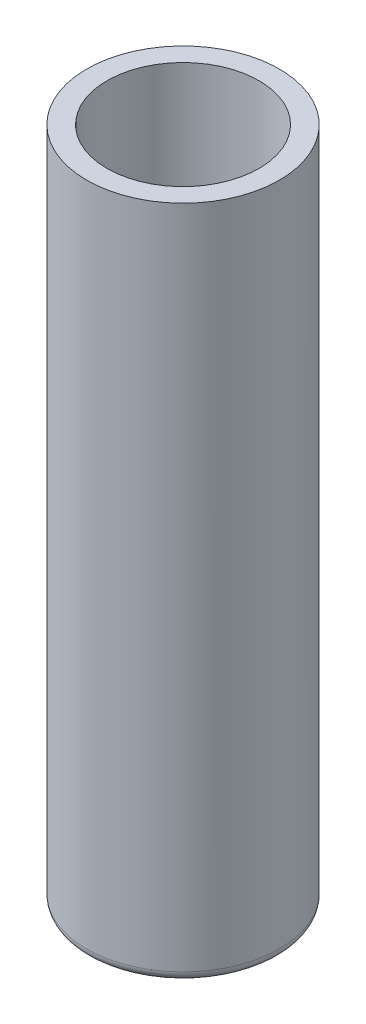
ISO-10303-21;
HEADER;
FILE_DESCRIPTION(('STEP AP214'),'2;1');
FILE_NAME('part.step','',(''),(''),'','','');
FILE_SCHEMA(('AUTOMOTIVE_DESIGN { 1 0 10303 214 1 1 1 1 }'));
ENDSEC;
DATA;
#1=APPLICATION_CONTEXT('core data for automotive mechanical design processes');
#2=APPLICATION_PROTOCOL_DEFINITION('international standard','automotive_design',2000,#1);
#3=PRODUCT_CONTEXT('',#1,'mechanical');
#4=PRODUCT('Part','Part','',(#3));
#5=PRODUCT_RELATED_PRODUCT_CATEGORY('part','',(#4));
#6=PRODUCT_DEFINITION_FORMATION('','',#4);
#7=PRODUCT_DEFINITION_CONTEXT('part definition',#1,'design');
#8=PRODUCT_DEFINITION('design','',#6,#7);
#9=PRODUCT_DEFINITION_SHAPE('','',#8);
#10=(LENGTH_UNIT() NAMED_UNIT(*) SI_UNIT(.MILLI.,.METRE.));
#11=(NAMED_UNIT(*) PLANE_ANGLE_UNIT() SI_UNIT($,.RADIAN.));
#12=(NAMED_UNIT(*) SI_UNIT($,.STERADIAN.) SOLID_ANGLE_UNIT());
#13=UNCERTAINTY_MEASURE_WITH_UNIT(LENGTH_MEASURE(1.E-05),#10,'distance_accuracy_value','');
#14=(GEOMETRIC_REPRESENTATION_CONTEXT(3) GLOBAL_UNCERTAINTY_ASSIGNED_CONTEXT((#13)) GLOBAL_UNIT_ASSIGNED_CONTEXT((#10,
#11,#12)) REPRESENTATION_CONTEXT('',''));
#15=CARTESIAN_POINT('',(0.,0.,0.));
#16=DIRECTION('',(0.,0.,1.));
#17=DIRECTION('',(1.,0.,0.));
#18=AXIS2_PLACEMENT_3D('',#15,#16,#17);
#19=CARTESIAN_POINT('',(0.,0.644355282187,0.774237036705));
#20=DIRECTION('',(0.,1.,0.));
#21=DIRECTION('',(0.,0.,1.));
#22=AXIS2_PLACEMENT_3D('',#19,#20,#21);
#23=PLANE('',#22);
#24=CARTESIAN_POINT('',(0.,0.644355282187,0.));
#25=DIRECTION('',(0.,-1.,0.));
#26=DIRECTION('',(0.,0.,-1.));
#27=AXIS2_PLACEMENT_3D('',#24,#25,#26);
#28=CIRCLE('',#27,0.774237036705);
#29=CARTESIAN_POINT('',(0.,0.644355282187,-0.774237036705));
#30=VERTEX_POINT('',#29);
#31=EDGE_CURVE('E120',#30,#30,#28,.T.);
#32=ORIENTED_EDGE('',*,*,#31,.T.);
#33=EDGE_LOOP('',(#32));
#34=FACE_BOUND('',#33,.T.);
#35=ADVANCED_FACE('F16',(#34),#23,.F.);
#36=CARTESIAN_POINT('',(0.,0.323807125575,1.3491904568));
#37=CARTESIAN_POINT('',(0.,0.353262221282,1.32215549052));
#38=CARTESIAN_POINT('',(0.,0.381219804809,1.29383961818));
#39=CARTESIAN_POINT('',(0.,0.407679876157,1.2642428398));
#40=CARTESIAN_POINT('',(0.,0.488846989831,1.16384237585));
#41=CARTESIAN_POINT('',(0.,0.554181499343,1.04989939876));
#42=CARTESIAN_POINT('',(0.,0.591831059317,0.964505493118));
#43=CARTESIAN_POINT('',(0.,0.621888986932,0.8726180391));
#44=CARTESIAN_POINT('',(0.,0.644355282187,0.774237036705));
#45=(BOUNDED_CURVE() B_SPLINE_CURVE(5,(#36,#37,#38,#39,#40,#41,#42,#43,#44),.UNSPECIFIED.,.F.,
.F.) B_SPLINE_CURVE_WITH_KNOTS((6,3,6),(0.582420147271,0.789666510541,1.2562929266),
.UNSPECIFIED.) CURVE() GEOMETRIC_REPRESENTATION_ITEM() RATIONAL_B_SPLINE_CURVE((1.,1.,1.,1.,1.,
1.,1.,1.,1.)) REPRESENTATION_ITEM(''));
#46=CARTESIAN_POINT('',(0.,0.218004316092,0.));
#47=DIRECTION('',(0.,-1.,0.));
#48=AXIS1_PLACEMENT('',#46,#47);
#49=SURFACE_OF_REVOLUTION('',#45,#48);
#50=ORIENTED_EDGE('',*,*,#31,.F.);
#51=EDGE_LOOP('',(#50));
#52=FACE_BOUND('',#51,.T.);
#53=CARTESIAN_POINT('',(0.,0.323807125575074,0.));
#54=DIRECTION('',(0.,1.,0.));
#55=DIRECTION('',(0.479425538604203,0.,0.877582561890372));
#56=AXIS2_PLACEMENT_3D('',#53,#54,#55);
#57=CIRCLE('',#56,1.34919045680404);
#58=CARTESIAN_POINT('',(0.646836361432927,0.323807125575074,1.18402601756013));
#59=VERTEX_POINT('',#58);
#60=EDGE_CURVE('E123',#59,#59,#57,.T.);
#61=ORIENTED_EDGE('',*,*,#60,.F.);
#62=EDGE_LOOP('',(#61));
#63=FACE_BOUND('',#62,.T.);
#64=ADVANCED_FACE('F138',(#52,#63),#49,.T.);
#65=CARTESIAN_POINT('',(0.,2.,0.));
#66=DIRECTION('',(0.,1.,0.));
#67=DIRECTION('',(0.,0.,1.));
#68=AXIS2_PLACEMENT_3D('',#65,#66,#67);
#69=PLANE('',#68);
#70=CARTESIAN_POINT('',(0.,2.,0.));
#71=DIRECTION('',(0.,1.,0.));
#72=DIRECTION('',(0.,0.,1.));
#73=AXIS2_PLACEMENT_3D('',#70,#71,#72);
#74=CIRCLE('',#73,2.25);
#75=CARTESIAN_POINT('',(0.,2.,2.25));
#76=VERTEX_POINT('',#75);
#77=EDGE_CURVE('E124',#76,#76,#74,.T.);
#78=ORIENTED_EDGE('',*,*,#77,.T.);
#79=EDGE_LOOP('',(#78));
#80=FACE_BOUND('',#79,.T.);
#81=ADVANCED_FACE('F141',(#80),#69,.T.);
#82=CARTESIAN_POINT('',(0.,1.,0.));
#83=DIRECTION('',(0.,1.,0.));
#84=DIRECTION('',(0.479425538604204,0.,0.877582561890373));
#85=AXIS2_PLACEMENT_3D('',#82,#83,#84);
#86=TOROIDAL_SURFACE('',#85,2.08591509775,1.);
#87=ORIENTED_EDGE('',*,*,#60,.T.);
#88=EDGE_LOOP('',(#87));
#89=FACE_BOUND('',#88,.T.);
#90=CARTESIAN_POINT('',(0.,0.,0.));
#91=DIRECTION('',(0.,-1.,0.));
#92=DIRECTION('',(-0.479425538604284,0.,-0.877582561890328));
#93=AXIS2_PLACEMENT_3D('',#90,#91,#92);
#94=CIRCLE('',#93,2.08591509775083);
#95=CARTESIAN_POINT('',(-1.00004085929464,0.,-1.83056277542366));
#96=VERTEX_POINT('',#95);
#97=CARTESIAN_POINT('',(1.00004096922105,0.,1.83056271536982));
#98=VERTEX_POINT('',#97);
#99=EDGE_CURVE('E46',#96,#98,#94,.T.);
#100=ORIENTED_EDGE('',*,*,#99,.T.);
#101=CARTESIAN_POINT('',(1.00004096922142,0.,1.83056271536922));
#102=CARTESIAN_POINT('',(0.973620016228702,2.55590095980319E-10,1.84499716544792));
#103=CARTESIAN_POINT('',(0.946888830593454,2.50192515225927E-11,1.85886387068713));
#104=CARTESIAN_POINT('',(0.89285595730822,2.83330282901089E-10,1.88543837733781));
#105=CARTESIAN_POINT('',(0.865554260817494,7.72223315841215E-10,1.89814616077403));
#106=CARTESIAN_POINT('',(0.810430256068048,4.16138878335174E-09,1.92237935423339));
#107=CARTESIAN_POINT('',(0.78260793092103,7.06173957446335E-09,1.93390472582225));
#108=CARTESIAN_POINT('',(0.726491800008633,1.79146607612937E-08,1.95575111161621));
#109=CARTESIAN_POINT('',(0.698197970982394,2.58674811349764E-08,1.96607206620118));
#110=CARTESIAN_POINT('',(0.655446891171035,4.62696584589538E-08,1.98063889023116));
#111=CARTESIAN_POINT('',(0.64114404762303,5.44831972945107E-08,1.98534228705848));
#112=CARTESIAN_POINT('',(0.612429183835539,7.19644363400583E-08,1.99443858163827));
#113=CARTESIAN_POINT('',(0.598017095721739,8.1232852463539E-08,1.9988312652009));
#114=CARTESIAN_POINT('',(0.554638750983609,1.04003647469847E-07,2.01152602768013));
#115=CARTESIAN_POINT('',(0.525529430669982,1.1247255857007E-07,2.01934515437546));
#116=CARTESIAN_POINT('',(0.46699265250406,1.12410175096491E-07,2.0336761164968));
#117=CARTESIAN_POINT('',(0.43756519605851,1.03878955663797E-07,2.0401879577009));
#118=CARTESIAN_POINT('',(0.378453379659475,7.38262440918185E-08,2.05191616216019));
#119=CARTESIAN_POINT('',(0.348769033555702,5.23054480128835E-08,2.0571325948101));
#120=CARTESIAN_POINT('',(0.289191910216967,1.71166566192791E-08,2.06616342920765));
#121=CARTESIAN_POINT('',(0.259299154711054,3.44785468011661E-09,2.06997797495469));
#122=CARTESIAN_POINT('',(0.21381055874295,-1.78948346428999E-09,2.07497512464698));
#123=CARTESIAN_POINT('',(0.198253723325132,-8.25698081945442E-10,2.07654116959));
#124=CARTESIAN_POINT('',(0.128688535158807,5.09055162199945E-09,2.08275397412306));
#125=CARTESIAN_POINT('',(0.0744846540359525,1.40177217768786E-08,2.08547169885343));
#126=CARTESIAN_POINT('',(-0.00495417032186562,4.20990059427245E-08,2.08635457221228));
#127=CARTESIAN_POINT('',(-0.0301871298532294,5.32361669127613E-08,2.08617666581318));
#128=CARTESIAN_POINT('',(-0.0856680761166048,7.45567110440251E-08,2.08476283154714));
#129=CARTESIAN_POINT('',(-0.115911798386098,8.41060365691973E-08,2.08332281456203));
#130=CARTESIAN_POINT('',(-0.159760631238324,8.96318324655248E-08,2.08025775210371));
#131=CARTESIAN_POINT('',(-0.173405507921172,9.01777509409901E-08,2.07916610517971));
#132=CARTESIAN_POINT('',(-0.202444778352549,8.93129469429258E-08,2.07655012775837));
#133=CARTESIAN_POINT('',(-0.217835785064478,8.76383717942788E-08,2.07498797856895));
#134=CARTESIAN_POINT('',(-0.263949791444024,8.10999200787094E-08,2.06978530692665));
#135=CARTESIAN_POINT('',(-0.294616158348227,7.47212926439495E-08,2.06562839922522));
#136=CARTESIAN_POINT('',(-0.355728189931065,5.86728548987548E-08,2.05593861830656));
#137=CARTESIAN_POINT('',(-0.386173861942035,4.90031544470416E-08,2.05040579102031));
#138=CARTESIAN_POINT('',(-0.446789143862353,2.9545331306053E-08,2.03799450685844));
#139=CARTESIAN_POINT('',(-0.476958767730657,1.97572146635175E-08,2.031116118422));
#140=CARTESIAN_POINT('',(-0.536941650139671,5.3719905619769E-09,2.01595918846943));
#141=CARTESIAN_POINT('',(-0.566754932887884,7.74528477617194E-10,2.00768074264962));
#142=CARTESIAN_POINT('',(-0.608450561089243,-3.14993293576871E-10,1.99524188413974));
#143=CARTESIAN_POINT('',(-0.620476742782648,2.3154627591072E-12,1.99155235059498));
#144=CARTESIAN_POINT('',(-0.66531437873013,2.02327735821238E-09,1.97734724447358));
#145=CARTESIAN_POINT('',(-0.697904136701555,5.17818525262745E-09,1.96611840245121));
#146=CARTESIAN_POINT('',(-0.757855990764666,1.66098090604508E-08,1.94379454528107));
#147=CARTESIAN_POINT('',(-0.785297411762699,2.40869470050219E-08,1.93291136447365));
#148=CARTESIAN_POINT('',(-0.824839225806196,3.66334486994587E-08,1.91624452028575));
#149=CARTESIAN_POINT('',(-0.837135014590332,4.07883716598536E-08,1.91092100730543));
#150=CARTESIAN_POINT('',(-0.876881734521019,5.31520181403223E-08,1.89324899409561));
#151=CARTESIAN_POINT('',(-0.904118973119294,5.99581046390181E-08,1.88041525831659));
#152=CARTESIAN_POINT('',(-0.960066175258996,6.47107804711426E-08,1.85252980186985));
#153=CARTESIAN_POINT('',(-0.988728986724914,6.19382595539475E-08,1.83738347263796));
#154=CARTESIAN_POINT('',(-1.03706400288067,5.26852898473215E-08,1.81036513960866));
#155=CARTESIAN_POINT('',(-1.05692250060451,4.75205478015137E-08,1.79882491401922));
#156=CARTESIAN_POINT('',(-1.0946767376956,3.91701273086659E-08,1.77604638700863));
#157=CARTESIAN_POINT('',(-1.11260244105081,3.5859213929405E-08,1.76485774113828));
#158=CARTESIAN_POINT('',(-1.14911419568272,2.94195925467909E-08,1.74128975483843));
#159=CARTESIAN_POINT('',(-1.16767991887689,2.63119169178077E-08,1.72887888040307));
#160=CARTESIAN_POINT('',(-1.20234783748841,2.11102525773182E-08,1.70489105016149));
#161=CARTESIAN_POINT('',(-1.21849316797756,1.89417339467199E-08,1.69337625300445));
#162=CARTESIAN_POINT('',(-1.26038544782857,1.37765934258419E-08,1.66258836280261));
#163=CARTESIAN_POINT('',(-1.28586062934619,1.1103429270499E-08,1.6429430003077));
#164=CARTESIAN_POINT('',(-1.32810511434412,8.08439385705062E-09,1.60878907469262));
#165=CARTESIAN_POINT('',(-1.34511927237676,7.27340786857504E-09,1.59458178485156));
#166=CARTESIAN_POINT('',(-1.37111476094013,5.83265156735253E-09,1.57215945762858));
#167=CARTESIAN_POINT('',(-1.3802580421762,5.28612021387553E-09,1.56413183849364));
#168=CARTESIAN_POINT('',(-1.39056409331469,6.48649450592304E-09,1.55494410959932));
#169=CARTESIAN_POINT('',(-1.39178727259301,6.65824743617644E-09,1.55385141435388));
#170=CARTESIAN_POINT('',(-1.40929719170774,9.3710678431113E-09,1.5381737539224));
#171=CARTESIAN_POINT('',(-1.42536634464787,1.50152782067024E-08,1.52334384218931));
#172=CARTESIAN_POINT('',(-1.46335183889691,2.8103548030481E-08,1.4871415106579));
#173=CARTESIAN_POINT('',(-1.48503598163178,3.53644698089976E-08,1.46552488068722));
#174=CARTESIAN_POINT('',(-1.52742595646814,4.80372796771684E-08,1.42135228617864));
#175=CARTESIAN_POINT('',(-1.54813175761216,5.34491092900673E-08,1.39879629195903));
#176=CARTESIAN_POINT('',(-1.58852025333664,5.99856148680693E-08,1.3527854527112));
#177=CARTESIAN_POINT('',(-1.60820293424188,6.11102335440029E-08,1.32933059567588));
#178=CARTESIAN_POINT('',(-1.64650791214094,5.88496213345817E-08,1.28157052400167));
#179=CARTESIAN_POINT('',(-1.66513021432492,5.54644125251946E-08,1.25726531352591));
#180=CARTESIAN_POINT('',(-1.70127293482178,4.53088834710271E-08,1.20785025760038));
#181=CARTESIAN_POINT('',(-1.71879337863637,3.85386416028602E-08,1.18274043079319));
#182=CARTESIAN_POINT('',(-1.75271316245621,2.40055590679609E-08,1.13177530020019));
#183=CARTESIAN_POINT('',(-1.76911254885794,1.62427595177713E-08,1.1059200273287));
#184=CARTESIAN_POINT('',(-1.80069947247214,4.57194458387676E-09,1.05348195796478));
#185=CARTESIAN_POINT('',(-1.8158870819396,6.63699205394495E-10,1.02689920497714));
#186=CARTESIAN_POINT('',(-1.83691105160346,-2.87097531548682E-10,0.98842272375118));
#187=CARTESIAN_POINT('',(-1.84316354705826,3.29189826884568E-11,0.976753004872265));
#188=CARTESIAN_POINT('',(-1.86577485366657,2.42535156212427E-09,0.933561420534501));
#189=CARTESIAN_POINT('',(-1.88143908493151,6.54020423520969E-09,0.901670994362836));
#190=CARTESIAN_POINT('',(-1.90894561872275,2.12760867572818E-08,0.841878117774608));
#191=CARTESIAN_POINT('',(-1.92101134536298,3.08526689267056E-08,0.814077942285054));
#192=CARTESIAN_POINT('',(-1.93769720502207,4.70332807210353E-08,0.773204546754575));
#193=CARTESIAN_POINT('',(-1.94280384661165,5.24292295493686E-08,0.76032838606597));
#194=CARTESIAN_POINT('',(-1.95894590804127,6.85143482907463E-08,0.718393631715627));
#195=CARTESIAN_POINT('',(-1.96945422866863,7.74381149805578E-08,0.689129916876406));
#196=CARTESIAN_POINT('',(-1.98986001692114,8.38505205563952E-08,0.627952359565862));
#197=CARTESIAN_POINT('',(-1.99965331174465,8.04357180023634E-08,0.596003771523798));
#198=CARTESIAN_POINT('',(-2.01515544136504,6.86057811798089E-08,0.540661822191023));
#199=CARTESIAN_POINT('',(-2.02124081920852,6.18550490467588E-08,0.517373166219054));
#200=CARTESIAN_POINT('',(-2.0321331994681,5.09120315059358E-08,0.472543153280408));
#201=CARTESIAN_POINT('',(-2.03700440787522,4.65537773285179E-08,0.451017388246431));
#202=CARTESIAN_POINT('',(-2.04629703647807,3.80424950778996E-08,0.406695673807824));
#203=CARTESIAN_POINT('',(-2.05068176957652,3.39120105006511E-08,0.383892008735471));
#204=CARTESIAN_POINT('',(-2.05821901065029,2.69551349000042E-08,0.340832844133887));
#205=CARTESIAN_POINT('',(-2.06145570972763,2.40326359917876E-08,0.320591958709928));
#206=CARTESIAN_POINT('',(-2.06909823803521,1.70762845084099E-08,0.267818354766455));
#207=CARTESIAN_POINT('',(-2.07303602609716,1.34315205411491E-08,0.235216305359772));
#208=CARTESIAN_POINT('',(-2.07832540206102,9.07370958856472E-09,0.180700082374089));
#209=CARTESIAN_POINT('',(-2.08010158212812,7.78931308740085E-09,0.158825943741013));
#210=CARTESIAN_POINT('',(-2.08224787302048,5.58977054821366E-09,0.125893339213358));
#211=CARTESIAN_POINT('',(-2.08287842851809,4.80745063113927E-09,0.114851594649339));
#212=CARTESIAN_POINT('',(-2.08349174460766,5.33837623119273E-09,0.102646961101262));
#213=CARTESIAN_POINT('',(-2.08354916975235,5.40271789463204E-09,0.101487645008398));
#214=CARTESIAN_POINT('',(-2.08463705496358,6.84464976970062E-09,0.0791749660568968));
#215=CARTESIAN_POINT('',(-2.08536920785719,1.17340765930165E-08,0.0580057920622636));
#216=CARTESIAN_POINT('',(-2.08633134052462,2.25127701415499E-08,0.00718377634545966));
#217=CARTESIAN_POINT('',(-2.08624330848654,2.8019669618369E-08,-0.0224754793815258));
#218=CARTESIAN_POINT('',(-2.08479777938063,3.7825245096885E-08,-0.0817631750239387));
#219=CARTESIAN_POINT('',(-2.08344024679579,4.21238872906026E-08,-0.111391614053985));
#220=CARTESIAN_POINT('',(-2.07945040191561,4.72766782490763E-08,-0.170563136432743));
#221=CARTESIAN_POINT('',(-2.07681807458477,4.81307863862885E-08,-0.200106218770583));
#222=CARTESIAN_POINT('',(-2.07028574443831,4.63212588238489E-08,-0.259051700642297));
#223=CARTESIAN_POINT('',(-2.06638574718487,4.36576385588191E-08,-0.288454100792869));
#224=CARTESIAN_POINT('',(-2.05732427144374,3.56388796520543E-08,-0.347063222769805));
#225=CARTESIAN_POINT('',(-2.05216281890636,3.02837963759595E-08,-0.37626994860883));
#226=CARTESIAN_POINT('',(-2.04059029279259,1.89100487815844E-08,-0.434433781888149));
#227=CARTESIAN_POINT('',(-2.03417926515055,1.28914088591578E-08,-0.463390898463227));
#228=CARTESIAN_POINT('',(-2.0201120569086,3.47517488659849E-09,-0.52099924967929));
#229=CARTESIAN_POINT('',(-2.01245594224203,7.74421015489405E-11,-0.549650500431771));
#230=CARTESIAN_POINT('',(-1.99559424329144,-8.06903618768968E-11,-0.607798360975493));
#231=CARTESIAN_POINT('',(-1.98633713711208,3.44328646412929E-09,-0.637280021805686));
#232=CARTESIAN_POINT('',(-1.96656179857412,5.88744414924451E-09,-0.69581611084586));
#233=CARTESIAN_POINT('',(-1.95604359891139,4.80774434097143E-09,-0.724870550110327));
#234=CARTESIAN_POINT('',(-1.93376305434611,2.29465671035439E-09,-0.782499701199165));
#235=CARTESIAN_POINT('',(-1.92200067501864,8.6125910016362E-10,-0.811074399724339));
#236=CARTESIAN_POINT('',(-1.89723440000733,5.04750460977923E-10,-0.867683302499934));
#237=CARTESIAN_POINT('',(-1.88423040350267,1.58184345340755E-09,-0.895717462635444));
#238=CARTESIAN_POINT('',(-1.86386887805592,5.27230073846141E-08,-0.93735059195679));
#239=CARTESIAN_POINT('',(-1.85693855196033,7.80281441154535E-08,-0.951159656229674));
#240=CARTESIAN_POINT('',(-1.84703923402281,9.39482694707117E-08,-0.970224768482834));
#241=CARTESIAN_POINT('',(-1.84423037039144,9.63063028144805E-08,-0.975563923413399));
#242=CARTESIAN_POINT('',(-1.82819664427281,1.03145304744909E-07,-1.00569279885735));
#243=CARTESIAN_POINT('',(-1.81444719307063,8.3851406345384E-08,-1.03020545524118));
#244=CARTESIAN_POINT('',(-1.78242642280068,4.84571712002247E-08,-1.08469196011908));
#245=CARTESIAN_POINT('',(-1.76388199437419,3.43502309745508E-08,-1.1145048037605));
#246=CARTESIAN_POINT('',(-1.71914224149379,1.01442409128504E-08,-1.18252540770602));
#247=CARTESIAN_POINT('',(-1.69239505535754,2.76444816756647E-09,-1.22037310806868));
#248=CARTESIAN_POINT('',(-1.65016700744607,-4.3153584945668E-10,-1.27617072492337));
#249=CARTESIAN_POINT('',(-1.63557273520754,-1.37667229284311E-10,-1.2948004682836));
#250=CARTESIAN_POINT('',(-1.60172019640364,1.75147917318662E-10,-1.33657571530106));
#251=CARTESIAN_POINT('',(-1.58227390446825,9.7462863602556E-11,-1.35956976486948));
#252=CARTESIAN_POINT('',(-1.5424055607416,1.28111386354719E-09,-1.40469596272553));
#253=CARTESIAN_POINT('',(-1.52198348571647,2.54248181590192E-09,-1.4268280904676));
#254=CARTESIAN_POINT('',(-1.48020871108127,8.41734104361082E-09,-1.47019731827349));
#255=CARTESIAN_POINT('',(-1.45885597565079,1.30309614518726E-08,-1.49143438382506));
#256=CARTESIAN_POINT('',(-1.41525500778331,2.80481736304582E-08,-1.53297226603727));
#257=CARTESIAN_POINT('',(-1.39300672774609,3.84520735451411E-08,-1.55327303280813));
#258=CARTESIAN_POINT('',(-1.35899894990591,6.2995141957526E-08,-1.58299532927535));
#259=CARTESIAN_POINT('',(-1.3475565031593,7.2666456117329E-08,-1.59278178882164));
#260=CARTESIAN_POINT('',(-1.32445238876531,9.27629786237313E-08,-1.61210878031469));
#261=CARTESIAN_POINT('',(-1.31279057654226,1.03188698043607E-07,-1.62164913949127));
#262=CARTESIAN_POINT('',(-1.27748930798247,1.28289800064003E-07,-1.64987595589744));
#263=CARTESIAN_POINT('',(-1.25353319572737,1.36790332202173E-07,-1.66816887353146));
#264=CARTESIAN_POINT('',(-1.20483179832901,1.3411487964563E-07,-1.70366969449366));
#265=CARTESIAN_POINT('',(-1.18008652006945,1.22939066536489E-07,-1.72087760728214));
#266=CARTESIAN_POINT('',(-1.12985515256796,8.66493964949862E-08,-1.75417305155361));
#267=CARTESIAN_POINT('',(-1.1043691081103,6.15363805059561E-08,-1.77026065056821));
#268=CARTESIAN_POINT('',(-1.05270887061602,1.92992691818116E-08,-1.80128335350062));
#269=CARTESIAN_POINT('',(-1.02653475493557,2.17427981862714E-09,-1.81621858623621));
#270=CARTESIAN_POINT('',(-1.00004078601,0.,-1.83056281546));
#271=B_SPLINE_CURVE_WITH_KNOTS('',3,(#101,#102,#103,#104,#105,#106,#107,#108,#109,#110,#111,
#112,#113,#114,#115,#116,#117,#118,#119,#120,#121,#122,#123,#124,#125,#126,#127,#128,#129,#130,
#131,#132,#133,#134,#135,#136,#137,#138,#139,#140,#141,#142,#143,#144,#145,#146,#147,#148,#149,
#150,#151,#152,#153,#154,#155,#156,#157,#158,#159,#160,#161,#162,#163,#164,#165,#166,#167,#168,
#169,#170,#171,#172,#173,#174,#175,#176,#177,#178,#179,#180,#181,#182,#183,#184,#185,#186,#187,
#188,#189,#190,#191,#192,#193,#194,#195,#196,#197,#198,#199,#200,#201,#202,#203,#204,#205,#206,
#207,#208,#209,#210,#211,#212,#213,#214,#215,#216,#217,#218,#219,#220,#221,#222,#223,#224,#225,
#226,#227,#228,#229,#230,#231,#232,#233,#234,#235,#236,#237,#238,#239,#240,#241,#242,#243,#244,
#245,#246,#247,#248,#249,#250,#251,#252,#253,#254,#255,#256,#257,#258,#259,#260,#261,#262,#263,
#264,#265,#266,#267,#268,#269,#270),.UNSPECIFIED.,.F.,.F.,(4,2,2,2,2,2,2,2,2,2,2,2,2,2,2,2,2,2,
2,2,2,2,2,2,2,2,2,2,2,2,2,2,2,2,2,2,2,2,2,2,2,2,2,2,2,2,2,2,2,2,2,2,2,2,2,2,2,2,2,2,2,2,2,2,2,2,
2,2,2,2,2,2,2,2,2,2,2,2,2,2,2,2,2,2,4),(0.,0.0903136425888522,0.180628685733513,
0.270946663638675,0.36126911049953,0.406435088176155,0.451631903510086,0.542022419618622,
0.632412536199143,0.722797809558612,0.81317379610278,0.860080162088081,1.02268503526549,
1.09837557981275,1.18917363899864,1.23023701959967,1.27664379213827,1.36945018439902,
1.46225347900993,1.55505205459972,1.64784428981006,1.68558200072959,1.78894318161119,
1.87747834634243,1.91767283373449,2.00796934781347,2.10518747740542,2.17408006378262,
2.23746338296922,2.30444702315456,2.36393278164863,2.460405085478,2.52689223578997,
2.56339224745287,2.56831275865082,2.63390079025989,2.72572412296402,2.81755035927337,
2.90937782263464,3.00120483649476,3.09302972430263,3.18485080951088,3.27666641557757,
3.31638325363484,3.42291950425642,3.51380705256276,3.55536064018706,3.64860558870562,
3.74881185957179,3.82100983680247,3.88720917882321,3.95685962728448,4.01834625606349,
4.11682223562421,4.18265024508129,4.21582812485258,4.21931034174301,4.28284556334696,
4.37179476268716,4.46074645064749,4.54969918777093,4.63865153460064,4.72760205168124,
4.81654929955999,4.90549183878812,4.99816501698219,5.09083579299501,5.18350913376536,
5.27619000613379,5.3225375289211,5.34063610368272,5.42492467365269,5.53021399058746,
5.6691327008569,5.74012008481814,5.83043418877263,5.92075044422269,6.01107017895099,
6.10139472073193,6.14656181450797,6.19175979857785,6.28215248386577,6.37254438089734,
6.46293082445301,6.55330714943722),.UNSPECIFIED.);
#272=EDGE_CURVE('E44',#98,#96,#271,.T.);
#273=ORIENTED_EDGE('',*,*,#272,.T.);
#274=EDGE_LOOP('',(#100,#273));
#275=FACE_BOUND('',#274,.T.);
#276=ADVANCED_FACE('F48',(#89,#275),#86,.T.);
#277=CARTESIAN_POINT('',(0.,11.,0.));
#278=DIRECTION('',(0.,1.,0.));
#279=DIRECTION('',(0.,0.,1.));
#280=AXIS2_PLACEMENT_3D('',#277,#278,#279);
#281=CYLINDRICAL_SURFACE('',#280,2.25);
#282=CARTESIAN_POINT('',(0.,20.,0.));
#283=DIRECTION('',(0.,1.,0.));
#284=DIRECTION('',(0.,0.,1.));
#285=AXIS2_PLACEMENT_3D('',#282,#283,#284);
#286=CIRCLE('',#285,2.25);
#287=CARTESIAN_POINT('',(0.,20.,2.25));
#288=VERTEX_POINT('',#287);
#289=EDGE_CURVE('E51',#288,#288,#286,.F.);
#290=ORIENTED_EDGE('',*,*,#289,.F.);
#291=EDGE_LOOP('',(#290));
#292=FACE_BOUND('',#291,.T.);
#293=ORIENTED_EDGE('',*,*,#77,.F.);
#294=EDGE_LOOP('',(#293));
#295=FACE_BOUND('',#294,.T.);
#296=ADVANCED_FACE('F75',(#292,#295),#281,.F.);
#297=CARTESIAN_POINT('',(0.,0.,0.));
#298=DIRECTION('',(0.,1.,0.));
#299=DIRECTION('',(0.,0.,1.));
#300=AXIS2_PLACEMENT_3D('',#297,#298,#299);
#301=PLANE('',#300);
#302=ORIENTED_EDGE('',*,*,#272,.F.);
#303=ORIENTED_EDGE('',*,*,#99,.F.);
#304=EDGE_LOOP('',(#302,#303));
#305=FACE_BOUND('',#304,.T.);
#306=CARTESIAN_POINT('',(2.55,0.,0.));
#307=CARTESIAN_POINT('',(2.55000075259111,-1.18256286497364E-13,-0.0400519309004626));
#308=CARTESIAN_POINT('',(2.5490564070711,0.,-0.0801037996388674));
#309=CARTESIAN_POINT('',(2.54528291907517,0.,-0.160118659926399));
#310=CARTESIAN_POINT('',(2.54245377659924,1.18256286497359E-13,-0.200081651475526));
#311=CARTESIAN_POINT('',(2.53491609395779,-1.18256286497363E-13,-0.279830004519342));
#312=CARTESIAN_POINT('',(2.53020755379226,-4.13897002740774E-13,-0.31961536601403));
#313=CARTESIAN_POINT('',(2.51892174946101,4.13897002740769E-13,-0.398920143915073));
#314=CARTESIAN_POINT('',(2.51234448529529,1.53733172446571E-12,-0.438439560321427));
#315=CARTESIAN_POINT('',(2.49733582938716,-1.53733172446568E-12,-0.517124746610917));
#316=CARTESIAN_POINT('',(2.48890443764475,-5.73542989512192E-12,-0.556290516494053));
#317=CARTESIAN_POINT('',(2.47020603890889,5.73542989512202E-12,-0.63418135689729));
#318=CARTESIAN_POINT('',(2.45993903191543,2.14043878560226E-11,-0.672906427417392));
#319=CARTESIAN_POINT('',(2.43759301552415,-2.14043878560228E-11,-0.749830317135968));
#320=CARTESIAN_POINT('',(2.42551400612633,-7.98821215289693E-11,-0.788029136334443));
#321=CARTESIAN_POINT('',(2.39956771745065,7.98821215289678E-11,-0.863814185776763));
#322=CARTESIAN_POINT('',(2.38570043817279,2.98124098259846E-10,-0.901400416020608));
#323=CARTESIAN_POINT('',(2.35499632392849,-3.22871045252395E-10,-0.978973944131822));
#324=CARTESIAN_POINT('',(2.33800854160088,-1.25139210980707E-09,-1.0189015649917));
#325=CARTESIAN_POINT('',(2.30204326968768,5.34999091135765E-09,-1.09784937162304));
#326=CARTESIAN_POINT('',(2.28306580830201,1.28797751313886E-08,-1.13686957024591));
#327=CARTESIAN_POINT('',(2.2431620739681,5.26988240054245E-08,-1.21390106778939));
#328=CARTESIAN_POINT('',(2.22223577448661,8.49884258054141E-08,-1.25191235296469));
#329=CARTESIAN_POINT('',(2.17850090143168,2.47005188977696E-07,-1.32683834742109));
#330=CARTESIAN_POINT('',(2.15569224996597,3.76736384312492E-07,-1.36375301123763));
#331=CARTESIAN_POINT('',(2.10817128472262,6.72718885859097E-07,-1.43641047336559));
#332=CARTESIAN_POINT('',(2.08345640948203,8.3901990757429E-07,-1.47215159952516));
#333=CARTESIAN_POINT('',(2.03216354781769,9.69891146494426E-07,-1.54226417590412));
#334=CARTESIAN_POINT('',(2.0055857461418,9.34481339640528E-07,-1.57663576141315));
#335=CARTESIAN_POINT('',(1.95069026514413,7.06794432239931E-07,-1.64395374032234));
#336=CARTESIAN_POINT('',(1.92237289808641,5.14545409777652E-07,-1.67690038770991));
#337=CARTESIAN_POINT('',(1.86395114608696,1.79045521183499E-07,-1.74114828731855));
#338=CARTESIAN_POINT('',(1.83384722578079,3.57819801829531E-08,-1.77244996339505));
#339=CARTESIAN_POINT('',(1.78459586053275,-2.15757146890978E-08,-1.82161700383318));
#340=CARTESIAN_POINT('',(1.76584364011014,-4.07313466868653E-09,-1.83988289662486));
#341=CARTESIAN_POINT('',(1.72441013595615,2.91934909177209E-08,-1.87897505602653));
#342=CARTESIAN_POINT('',(1.70161883515245,4.41075359830089E-08,-1.89968523327805));
#343=CARTESIAN_POINT('',(1.64643249100507,1.13387703722609E-07,-1.94805753238798));
#344=CARTESIAN_POINT('',(1.61370468790367,1.80684233072926E-07,-1.97534175204398));
#345=CARTESIAN_POINT('',(1.56489161392106,2.96150501711964E-07,-2.01399037691821));
#346=CARTESIAN_POINT('',(1.54932891171479,3.35122167479757E-07,-2.02601993949507));
#347=CARTESIAN_POINT('',(1.51836029456161,4.03648754477069E-07,-2.04938040671316));
#348=CARTESIAN_POINT('',(1.50296201608447,4.33435011172871E-07,-2.06072143573122));
#349=CARTESIAN_POINT('',(1.4577143559112,5.04809239309924E-07,-2.09325571764274));
#350=CARTESIAN_POINT('',(1.42752312956759,5.32291930123223E-07,-2.11397742620273));
#351=CARTESIAN_POINT('',(1.37748689664738,5.18135375336552E-07,-2.1467211020715));
#352=CARTESIAN_POINT('',(1.35790503590493,4.98136460457213E-07,-2.15914831318753));
#353=CARTESIAN_POINT('',(1.31218658785721,4.41117943060185E-07,-2.18728630491382));
#354=CARTESIAN_POINT('',(1.28592750579504,4.00721802655802E-07,-2.20279892217519));
#355=CARTESIAN_POINT('',(1.23287305626377,3.29957002809768E-07,-2.23287416281425));
#356=CARTESIAN_POINT('',(1.20607770252055,2.99588087068508E-07,-2.24743681046589));
#357=CARTESIAN_POINT('',(1.14116324677661,2.30778718810899E-07,-2.28122154240466));
#358=CARTESIAN_POINT('',(1.10280073805622,1.93966810499114E-07,-2.29997818244512));
#359=CARTESIAN_POINT('',(1.02518352569255,1.30144385589552E-07,-2.3355416959669));
#360=CARTESIAN_POINT('',(0.985928854259979,1.03133515729918E-07,-2.35234863970688));
#361=CARTESIAN_POINT('',(0.923622674099274,6.79275269713394E-08,-2.37719369330507));
#362=CARTESIAN_POINT('',(0.900836572437141,5.66295900752022E-08,-2.38590302154407));
#363=CARTESIAN_POINT('',(0.855023657173742,3.68847030270215E-08,-2.40266376265003));
#364=CARTESIAN_POINT('',(0.831996848573314,2.8437693766057E-08,-2.41071518915479));
#365=CARTESIAN_POINT('',(0.783535935539327,1.4861796934397E-08,-2.42688590436714));
#366=CARTESIAN_POINT('',(0.758079987789138,1.01219335190215E-08,-2.43493969659173));
#367=CARTESIAN_POINT('',(0.700038429384482,2.88166574124558E-09,-2.4523108202094));
#368=CARTESIAN_POINT('',(0.667379488771549,1.3285017713958E-09,-2.46138408027383));
#369=CARTESIAN_POINT('',(0.598865802231268,-2.14813509822542E-10,-2.47896046191399));
#370=CARTESIAN_POINT('',(0.562980611212407,-5.69366048433879E-11,-2.48734496557207));
#371=CARTESIAN_POINT('',(0.48799084835367,6.39605655479197E-10,-2.50316580839337));
#372=CARTESIAN_POINT('',(0.448858824205106,1.20778454676559E-09,-2.51047224126722));
#373=CARTESIAN_POINT('',(0.367380148184013,1.95010585038866E-09,-2.52372429927219));
#374=CARTESIAN_POINT('',(0.32501047559569,2.09187190177432E-09,-2.52952867135992));
#375=CARTESIAN_POINT('',(0.237097058470145,1.84667755384847E-09,-2.53933141808604));
#376=CARTESIAN_POINT('',(0.191536282645877,1.4225073064192E-09,-2.54317729330441));
#377=CARTESIAN_POINT('',(0.0973228470885844,4.99617735721556E-10,-2.54858854251568));
#378=CARTESIAN_POINT('',(0.0486606777644302,-2.1479887929817E-12,-2.54999045359722));
#379=CARTESIAN_POINT('',(-0.0417252396157644,1.84184337737805E-12,-2.550008185787));
#380=CARTESIAN_POINT('',(-0.0834493825462367,3.74191651774412E-10,-2.54899262050299));
#381=CARTESIAN_POINT('',(-0.166798620839247,1.7320948176664E-09,-2.54491440074407));
#382=CARTESIAN_POINT('',(-0.208423715253353,2.71765402337795E-09,-2.54185172674573));
#383=CARTESIAN_POINT('',(-0.291473607677529,5.17268786980516E-09,-2.53368718008025));
#384=CARTESIAN_POINT('',(-0.332898403901402,6.64216681792415E-09,-2.5285852892618));
#385=CARTESIAN_POINT('',(-0.415448059652887,9.94726754192398E-09,-2.51635442713868));
#386=CARTESIAN_POINT('',(-0.456572916698565,1.17828923440319E-08,-2.50922543907966));
#387=CARTESIAN_POINT('',(-0.53842347350064,1.57105422893282E-08,-2.4929575760928));
#388=CARTESIAN_POINT('',(-0.579149170209249,1.78025693886324E-08,-2.48381868583083));
#389=CARTESIAN_POINT('',(-0.660103227926096,2.21422457499202E-08,-2.46355301109971));
#390=CARTESIAN_POINT('',(-0.700331585454119,2.43898961001782E-08,-2.45242621272825));
#391=CARTESIAN_POINT('',(-0.78019396292966,2.89487547426955E-08,-2.42821152344298));
#392=CARTESIAN_POINT('',(-0.819827979096828,3.12599634389574E-08,-2.41512362006122));
#393=CARTESIAN_POINT('',(-0.898406110136434,3.58626554886017E-08,-2.38701824993502));
#394=CARTESIAN_POINT('',(-0.937350221059923,3.81541387290389E-08,-2.37200077214994));
#395=CARTESIAN_POINT('',(-1.01445463936226,4.26428597342173E-08,-2.34007243839796));
#396=CARTESIAN_POINT('',(-1.05261494275349,4.48400970195441E-08,-2.32316157280127));
#397=CARTESIAN_POINT('',(-1.12805973383756,4.90745739323679E-08,-2.28748721611825));
#398=CARTESIAN_POINT('',(-1.1653442176319,5.11118128477618E-08,-2.26872371678724));
#399=CARTESIAN_POINT('',(-1.23894746903142,5.49693073706431E-08,-2.2293893148543));
#400=CARTESIAN_POINT('',(-1.27526623295221,5.67895621503869E-08,-2.20881840535803));
#401=CARTESIAN_POINT('',(-1.34685047291747,6.01648698264685E-08,-2.16591876564952));
#402=CARTESIAN_POINT('',(-1.38211594561333,6.1719921879749E-08,-2.14359002984963));
#403=CARTESIAN_POINT('',(-1.45150857158427,6.452537238456E-08,-2.09722856081472));
#404=CARTESIAN_POINT('',(-1.48563572196428,6.57757700613227E-08,-2.07319582324646));
#405=CARTESIAN_POINT('',(-1.55266941715676,6.79412271625755E-08,-2.02348428480016));
#406=CARTESIAN_POINT('',(-1.58557595964103,6.88562859474693E-08,-1.99780548078268));
#407=CARTESIAN_POINT('',(-1.65008909690665,7.03291474826337E-08,-1.94486371460666));
#408=CARTESIAN_POINT('',(-1.68169569003503,7.08869497786399E-08,-1.91760075043386));
#409=CARTESIAN_POINT('',(-1.74353272197394,7.16321475680109E-08,-1.861556390766));
#410=CARTESIAN_POINT('',(-1.77376315990955,7.18195428258836E-08,-1.83277499430558));
#411=CARTESIAN_POINT('',(-1.83277499430558,7.18195428258947E-08,-1.77376315990956));
#412=CARTESIAN_POINT('',(-1.86155639076599,7.16321475680332E-08,-1.74353272197394));
#413=CARTESIAN_POINT('',(-1.91760075043386,7.08869497786177E-08,-1.68169569003503));
#414=CARTESIAN_POINT('',(-1.94486371460667,7.03291474825558E-08,-1.65008909690665));
#415=CARTESIAN_POINT('',(-1.99780548078266,6.88562859475472E-08,-1.58557595964104));
#416=CARTESIAN_POINT('',(-2.02348428480011,6.79412271628648E-08,-1.55266941715679));
#417=CARTESIAN_POINT('',(-2.0731958232465,6.57757700610334E-08,-1.48563572196426));
#418=CARTESIAN_POINT('',(-2.09722856081491,6.45253723834806E-08,-1.45150857158417));
#419=CARTESIAN_POINT('',(-2.14359002984944,6.17199218808284E-08,-1.38211594561343));
#420=CARTESIAN_POINT('',(-2.16591876564883,6.01648698304967E-08,-1.34685047291784));
#421=CARTESIAN_POINT('',(-2.20881840535872,5.67895621463588E-08,-1.27526623295185));
#422=CARTESIAN_POINT('',(-2.22938931485687,5.49693073556098E-08,-1.23894746903006));
#423=CARTESIAN_POINT('',(-2.26872371678467,5.11118128627951E-08,-1.16534421763326));
#424=CARTESIAN_POINT('',(-2.28748721610864,4.90745739884725E-08,-1.12805973384264));
#425=CARTESIAN_POINT('',(-2.32316157281088,4.48400970718597E-08,-1.05261494274842));
#426=CARTESIAN_POINT('',(-2.34007243843381,4.26428597416727E-08,-1.01445463934334));
#427=CARTESIAN_POINT('',(-2.37200077211408,3.81541387215836E-08,-0.937350221078842));
#428=CARTESIAN_POINT('',(-2.38701824980121,3.58626555110955E-08,-0.898406110207037));
#429=CARTESIAN_POINT('',(-2.41512362019502,3.12599634164637E-08,-0.819827979026232));
#430=CARTESIAN_POINT('',(-2.42821152394234,2.89487546452658E-08,-0.780193962666183));
#431=CARTESIAN_POINT('',(-2.4524262122289,2.43898961976074E-08,-0.700331585717599));
#432=CARTESIAN_POINT('',(-2.46355300923609,2.21422461171421E-08,-0.660103228909409));
#433=CARTESIAN_POINT('',(-2.48381868769444,1.78025690214131E-08,-0.579149169225945));
#434=CARTESIAN_POINT('',(-2.49295758304787,1.57105409178839E-08,-0.538423469830909));
#435=CARTESIAN_POINT('',(-2.50922543212464,1.17828937154658E-08,-0.456572920368269));
#436=CARTESIAN_POINT('',(-2.5163544011823,9.94727266042476E-09,-0.415448073348358));
#437=CARTESIAN_POINT('',(-2.52858531521796,6.64216169946567E-09,-0.332898390206047));
#438=CARTESIAN_POINT('',(-2.53368727694955,5.17266876746708E-09,-0.291473556565975));
#439=CARTESIAN_POINT('',(-2.54185162987729,2.71767312554595E-09,-0.208423766364458));
#440=CARTESIAN_POINT('',(-2.54491403922773,1.73216610763107E-09,-0.166798811587636));
#441=CARTESIAN_POINT('',(-2.5489929820159,3.74120362489651E-10,-0.0834491917996705));
#442=CARTESIAN_POINT('',(-2.55000953496511,1.57578940172591E-12,-0.0417245277432609));
#443=CARTESIAN_POINT('',(-2.55,0.,0.));
#444=B_SPLINE_CURVE_WITH_KNOTS('',3,(#306,#307,#308,#309,#310,#311,#312,#313,#314,#315,#316,
#317,#318,#319,#320,#321,#322,#323,#324,#325,#326,#327,#328,#329,#330,#331,#332,#333,#334,#335,
#336,#337,#338,#339,#340,#341,#342,#343,#344,#345,#346,#347,#348,#349,#350,#351,#352,#353,#354,
#355,#356,#357,#358,#359,#360,#361,#362,#363,#364,#365,#366,#367,#368,#369,#370,#371,#372,#373,
#374,#375,#376,#377,#378,#379,#380,#381,#382,#383,#384,#385,#386,#387,#388,#389,#390,#391,#392,
#393,#394,#395,#396,#397,#398,#399,#400,#401,#402,#403,#404,#405,#406,#407,#408,#409,#410,#411,
#412,#413,#414,#415,#416,#417,#418,#419,#420,#421,#422,#423,#424,#425,#426,#427,#428,#429,#430,
#431,#432,#433,#434,#435,#436,#437,#438,#439,#440,#441,#442,#443),.UNSPECIFIED.,.F.,.F.,(4,2,2,
2,2,2,2,2,2,2,2,2,2,2,2,2,2,2,2,2,2,2,2,2,2,2,2,2,2,2,2,2,2,2,2,2,2,2,2,2,2,2,2,2,2,2,2,2,2,2,2,
2,2,2,2,2,2,2,2,2,2,2,2,2,2,2,2,2,4),(0.,0.120144572607406,0.240289145214809,0.360433717822215,
0.480578290429621,0.600722863037024,0.72086743564443,0.841012008251836,0.961156580859241,
1.09127421967334,1.22139001456682,1.35150758123412,1.48163053490607,1.61193149236667,
1.74221954601332,1.87248428000494,2.00271528277654,2.08124159532572,2.17360700430893,
2.30137469092948,2.36038008454438,2.41774782286768,2.52756141316356,2.59713128692455,
2.68860644964796,2.780079274051,2.90813069591135,3.03617750191618,3.10935020351909,
3.18252138792278,3.26260766242179,3.36426797778439,3.47478883188627,3.5941702786934,
3.72241249061072,3.85951575860525,4.0054804922874,4.13064137717731,4.25580345575276,
4.3809666484347,4.50613087564409,4.63129605780188,4.75646211532902,4.88162896864646,
5.00679653817517,5.13196474433609,5.2571335075502,5.38230274823845,5.50747238682182,
5.63264234372127,5.75781253935779,5.88298289415235,6.00815332852592,6.13332376289951,
6.25849411769406,6.38366431333058,6.50883427023003,6.6340039088134,6.75917314950165,
6.88434191271576,7.00951011887668,7.13467768840539,7.25984454172283,7.38501059924997,
7.51017578140776,7.63534000861715,7.76050320129909,7.88566527987454,8.01082616476446),.UNSPECIFIED.);
#445=CARTESIAN_POINT('',(2.55,0.,0.));
#446=VERTEX_POINT('',#445);
#447=CARTESIAN_POINT('',(-2.55,0.,0.));
#448=VERTEX_POINT('',#447);
#449=EDGE_CURVE('E35',#446,#448,#444,.T.);
#450=ORIENTED_EDGE('',*,*,#449,.F.);
#451=CARTESIAN_POINT('',(0.,0.,0.));
#452=DIRECTION('',(0.,1.,0.));
#453=DIRECTION('',(-1.,0.,0.));
#454=AXIS2_PLACEMENT_3D('',#451,#452,#453);
#455=CIRCLE('',#454,2.55);
#456=EDGE_CURVE('E93',#448,#446,#455,.T.);
#457=ORIENTED_EDGE('',*,*,#456,.F.);
#458=EDGE_LOOP('',(#450,#457));
#459=FACE_BOUND('',#458,.T.);
#460=ADVANCED_FACE('F55',(#305,#459),#301,.F.);
#461=CARTESIAN_POINT('',(0.,20.,0.));
#462=DIRECTION('',(0.,1.,0.));
#463=DIRECTION('',(0.,0.,1.));
#464=AXIS2_PLACEMENT_3D('',#461,#462,#463);
#465=PLANE('',#464);
#466=ORIENTED_EDGE('',*,*,#289,.T.);
#467=EDGE_LOOP('',(#466));
#468=FACE_BOUND('',#467,.T.);
#469=CARTESIAN_POINT('',(0.,20.,0.));
#470=DIRECTION('',(0.,1.,0.));
#471=DIRECTION('',(0.,0.,1.));
#472=AXIS2_PLACEMENT_3D('',#469,#470,#471);
#473=CIRCLE('',#472,2.85);
#474=CARTESIAN_POINT('',(0.,20.,2.85));
#475=VERTEX_POINT('',#474);
#476=EDGE_CURVE('E27',#475,#475,#473,.F.);
#477=ORIENTED_EDGE('',*,*,#476,.F.);
#478=EDGE_LOOP('',(#477));
#479=FACE_BOUND('',#478,.T.);
#480=ADVANCED_FACE('F74',(#468,#479),#465,.T.);
#481=CARTESIAN_POINT('',(0.,0.3,0.));
#482=DIRECTION('',(0.,1.,0.));
#483=DIRECTION('',(-1.,0.,0.));
#484=AXIS2_PLACEMENT_3D('',#481,#482,#483);
#485=TOROIDAL_SURFACE('',#484,2.55,0.3);
#486=ORIENTED_EDGE('',*,*,#456,.T.);
#487=ORIENTED_EDGE('',*,*,#449,.T.);
#488=EDGE_LOOP('',(#486,#487));
#489=FACE_BOUND('',#488,.T.);
#490=CARTESIAN_POINT('',(0.,0.3,0.));
#491=DIRECTION('',(0.,1.,0.));
#492=DIRECTION('',(0.,0.,1.));
#493=AXIS2_PLACEMENT_3D('',#490,#491,#492);
#494=CIRCLE('',#493,2.85);
#495=CARTESIAN_POINT('',(0.,0.3,2.85));
#496=VERTEX_POINT('',#495);
#497=EDGE_CURVE('E11',#496,#496,#494,.T.);
#498=ORIENTED_EDGE('',*,*,#497,.F.);
#499=EDGE_LOOP('',(#498));
#500=FACE_BOUND('',#499,.T.);
#501=ADVANCED_FACE('F97',(#489,#500),#485,.T.);
#502=CARTESIAN_POINT('',(0.,10.,0.));
#503=DIRECTION('',(0.,1.,0.));
#504=DIRECTION('',(0.,0.,1.));
#505=AXIS2_PLACEMENT_3D('',#502,#503,#504);
#506=CYLINDRICAL_SURFACE('',#505,2.85);
#507=ORIENTED_EDGE('',*,*,#476,.T.);
#508=EDGE_LOOP('',(#507));
#509=FACE_BOUND('',#508,.T.);
#510=ORIENTED_EDGE('',*,*,#497,.T.);
#511=EDGE_LOOP('',(#510));
#512=FACE_BOUND('',#511,.T.);
#513=ADVANCED_FACE('F107',(#509,#512),#506,.T.);
#514=CLOSED_SHELL('',(#35,#64,#81,#276,#296,#460,#480,#501,#513));
#515=MANIFOLD_SOLID_BREP('B1',#514);
#516=ADVANCED_BREP_SHAPE_REPRESENTATION('',(#18,#515),#14);
#517=SHAPE_DEFINITION_REPRESENTATION(#9,#516);
ENDSEC;
END-ISO-10303-21;
